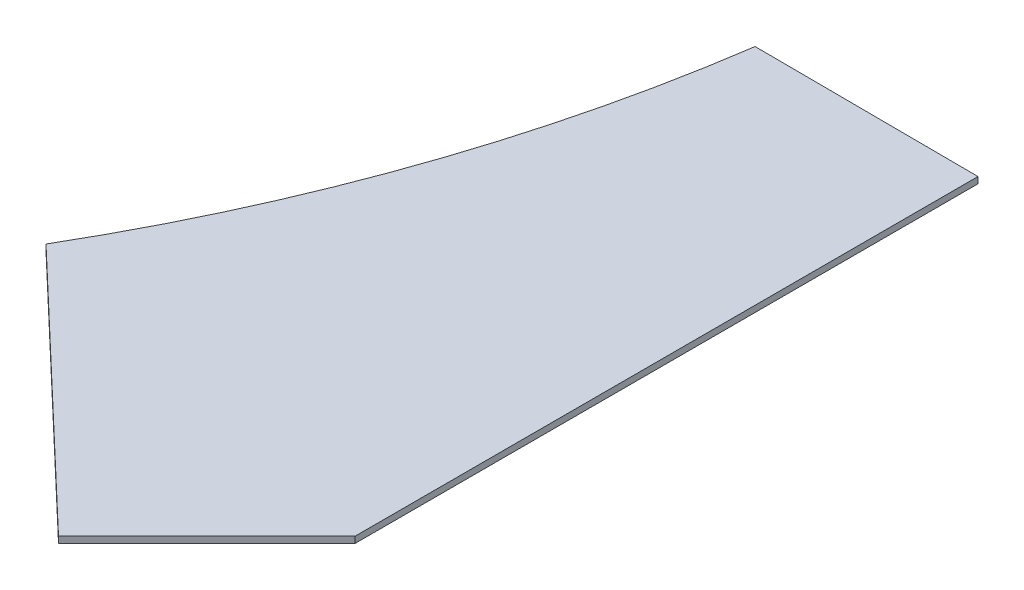
ISO-10303-21;
HEADER;
FILE_DESCRIPTION(('STEP AP214'),'2;1');
FILE_NAME('part.step','',(''),(''),'','','');
FILE_SCHEMA(('AUTOMOTIVE_DESIGN { 1 0 10303 214 1 1 1 1 }'));
ENDSEC;
DATA;
#1=APPLICATION_CONTEXT('core data for automotive mechanical design processes');
#2=APPLICATION_PROTOCOL_DEFINITION('international standard','automotive_design',2000,#1);
#3=PRODUCT_CONTEXT('',#1,'mechanical');
#4=PRODUCT('Part','Part','',(#3));
#5=PRODUCT_RELATED_PRODUCT_CATEGORY('part','',(#4));
#6=PRODUCT_DEFINITION_FORMATION('','',#4);
#7=PRODUCT_DEFINITION_CONTEXT('part definition',#1,'design');
#8=PRODUCT_DEFINITION('design','',#6,#7);
#9=PRODUCT_DEFINITION_SHAPE('','',#8);
#10=(LENGTH_UNIT() NAMED_UNIT(*) SI_UNIT(.MILLI.,.METRE.));
#11=(NAMED_UNIT(*) PLANE_ANGLE_UNIT() SI_UNIT($,.RADIAN.));
#12=(NAMED_UNIT(*) SI_UNIT($,.STERADIAN.) SOLID_ANGLE_UNIT());
#13=UNCERTAINTY_MEASURE_WITH_UNIT(LENGTH_MEASURE(1.E-05),#10,'distance_accuracy_value','');
#14=(GEOMETRIC_REPRESENTATION_CONTEXT(3) GLOBAL_UNCERTAINTY_ASSIGNED_CONTEXT((#13)) GLOBAL_UNIT_ASSIGNED_CONTEXT((#10,
#11,#12)) REPRESENTATION_CONTEXT('',''));
#15=CARTESIAN_POINT('',(0.,0.,0.));
#16=DIRECTION('',(0.,0.,1.));
#17=DIRECTION('',(1.,0.,0.));
#18=AXIS2_PLACEMENT_3D('',#15,#16,#17);
#19=CARTESIAN_POINT('',(264.,-2.,0.));
#20=DIRECTION('',(1.,0.,0.));
#21=DIRECTION('',(0.,0.,-1.));
#22=AXIS2_PLACEMENT_3D('',#19,#20,#21);
#23=PLANE('',#22);
#24=DIRECTION('',(0.,0.,1.));
#25=VECTOR('',#24,1.);
#26=CARTESIAN_POINT('',(264.,-2.,131.979594929244));
#27=LINE('',#26,#25);
#28=CARTESIAN_POINT('',(264.,-2.,33.2298257626164));
#29=VERTEX_POINT('',#28);
#30=CARTESIAN_POINT('',(264.,-2.,131.979594929244));
#31=VERTEX_POINT('',#30);
#32=EDGE_CURVE('E91',#29,#31,#27,.T.);
#33=ORIENTED_EDGE('',*,*,#32,.T.);
#34=DIRECTION('',(0.,1.,0.));
#35=VECTOR('',#34,1.);
#36=CARTESIAN_POINT('',(264.,-2.,131.979594929244));
#37=LINE('',#36,#35);
#38=CARTESIAN_POINT('',(264.,-3.,131.979594929244));
#39=VERTEX_POINT('',#38);
#40=EDGE_CURVE('E11',#39,#31,#37,.T.);
#41=ORIENTED_EDGE('',*,*,#40,.F.);
#42=DIRECTION('',(0.,0.,1.));
#43=VECTOR('',#42,1.);
#44=CARTESIAN_POINT('',(264.,-3.,131.979594929244));
#45=LINE('',#44,#43);
#46=CARTESIAN_POINT('',(264.,-3.,33.2298257626164));
#47=VERTEX_POINT('',#46);
#48=EDGE_CURVE('E89',#47,#39,#45,.T.);
#49=ORIENTED_EDGE('',*,*,#48,.F.);
#50=DIRECTION('',(0.,1.,0.));
#51=VECTOR('',#50,1.);
#52=CARTESIAN_POINT('',(264.,-3.,33.2298257626164));
#53=LINE('',#52,#51);
#54=EDGE_CURVE('E128',#47,#29,#53,.T.);
#55=ORIENTED_EDGE('',*,*,#54,.T.);
#56=EDGE_LOOP('',(#33,#41,#49,#55));
#57=FACE_BOUND('',#56,.T.);
#58=ADVANCED_FACE('F36',(#57),#23,.T.);
#59=CARTESIAN_POINT('',(0.,-2.,0.));
#60=DIRECTION('',(0.,1.,0.));
#61=DIRECTION('',(0.,0.,1.));
#62=AXIS2_PLACEMENT_3D('',#59,#60,#61);
#63=CYLINDRICAL_SURFACE('',#62,230.867927612304);
#64=CARTESIAN_POINT('',(0.,-2.,0.));
#65=DIRECTION('',(0.,1.,0.));
#66=DIRECTION('',(0.,0.,1.));
#67=AXIS2_PLACEMENT_3D('',#64,#65,#66);
#68=CIRCLE('',#67,230.867927612304);
#69=CARTESIAN_POINT('',(199.395295800083,-2.,116.368019716748));
#70=VERTEX_POINT('',#69);
#71=CARTESIAN_POINT('',(228.489590238678,-2.,33.053095960304));
#72=VERTEX_POINT('',#71);
#73=EDGE_CURVE('E74',#70,#72,#68,.T.);
#74=ORIENTED_EDGE('',*,*,#73,.T.);
#75=DIRECTION('',(0.,1.,0.));
#76=VECTOR('',#75,1.);
#77=CARTESIAN_POINT('',(228.489590238678,-3.,33.053095960304));
#78=LINE('',#77,#76);
#79=CARTESIAN_POINT('',(228.489590238678,-3.,33.053095960304));
#80=VERTEX_POINT('',#79);
#81=EDGE_CURVE('E45',#80,#72,#78,.T.);
#82=ORIENTED_EDGE('',*,*,#81,.F.);
#83=CARTESIAN_POINT('',(0.,-3.,0.));
#84=DIRECTION('',(0.,1.,0.));
#85=DIRECTION('',(0.,0.,1.));
#86=AXIS2_PLACEMENT_3D('',#83,#84,#85);
#87=CIRCLE('',#86,230.867927612304);
#88=CARTESIAN_POINT('',(199.395295800083,-3.,116.368019716748));
#89=VERTEX_POINT('',#88);
#90=EDGE_CURVE('E123',#89,#80,#87,.T.);
#91=ORIENTED_EDGE('',*,*,#90,.F.);
#92=DIRECTION('',(0.,1.,0.));
#93=VECTOR('',#92,1.);
#94=CARTESIAN_POINT('',(199.395295800083,-3.,116.368019716748));
#95=LINE('',#94,#93);
#96=EDGE_CURVE('E109',#89,#70,#95,.T.);
#97=ORIENTED_EDGE('',*,*,#96,.T.);
#98=EDGE_LOOP('',(#74,#82,#91,#97));
#99=FACE_BOUND('',#98,.T.);
#100=ADVANCED_FACE('F135',(#99),#63,.F.);
#101=CARTESIAN_POINT('',(264.,-2.,131.979594929244));
#102=DIRECTION('',(0.707107865975289,0.,0.707105696396142));
#103=DIRECTION('',(0.707105696396142,0.,-0.707107865975289));
#104=AXIS2_PLACEMENT_3D('',#101,#102,#103);
#105=PLANE('',#104);
#106=ORIENTED_EDGE('',*,*,#40,.T.);
#107=DIRECTION('',(-0.707105696396142,0.,0.707107865975289));
#108=VECTOR('',#107,1.);
#109=CARTESIAN_POINT('',(264.,-2.,131.979594929244));
#110=LINE('',#109,#108);
#111=CARTESIAN_POINT('',(240.494949992761,-2.,155.484717055922));
#112=VERTEX_POINT('',#111);
#113=EDGE_CURVE('E115',#31,#112,#110,.T.);
#114=ORIENTED_EDGE('',*,*,#113,.T.);
#115=DIRECTION('',(0.,1.,0.));
#116=VECTOR('',#115,1.);
#117=CARTESIAN_POINT('',(240.494949992761,-3.,155.484717055922));
#118=LINE('',#117,#116);
#119=CARTESIAN_POINT('',(240.494949992761,-3.,155.484717055922));
#120=VERTEX_POINT('',#119);
#121=EDGE_CURVE('E103',#120,#112,#118,.T.);
#122=ORIENTED_EDGE('',*,*,#121,.F.);
#123=DIRECTION('',(-0.707105696396142,0.,0.707107865975289));
#124=VECTOR('',#123,1.);
#125=CARTESIAN_POINT('',(240.494949992761,-3.,155.484717055922));
#126=LINE('',#125,#124);
#127=EDGE_CURVE('E97',#39,#120,#126,.T.);
#128=ORIENTED_EDGE('',*,*,#127,.F.);
#129=EDGE_LOOP('',(#106,#114,#122,#128));
#130=FACE_BOUND('',#129,.T.);
#131=ADVANCED_FACE('F101',(#130),#105,.T.);
#132=CARTESIAN_POINT('',(228.489590238678,-3.,33.053095960304));
#133=DIRECTION('',(-0.00497678328219708,0.,0.999987615737396));
#134=DIRECTION('',(0.999987615737396,0.,0.00497678328219708));
#135=AXIS2_PLACEMENT_3D('',#132,#133,#134);
#136=PLANE('',#135);
#137=DIRECTION('',(0.999987615737396,0.,0.00497678328219708));
#138=VECTOR('',#137,1.);
#139=CARTESIAN_POINT('',(228.489590238678,-2.,33.053095960304));
#140=LINE('',#139,#138);
#141=EDGE_CURVE('E68',#72,#29,#140,.T.);
#142=ORIENTED_EDGE('',*,*,#141,.T.);
#143=ORIENTED_EDGE('',*,*,#54,.F.);
#144=DIRECTION('',(0.999987615737396,0.,0.00497678328219708));
#145=VECTOR('',#144,1.);
#146=CARTESIAN_POINT('',(228.489590238678,-3.,33.053095960304));
#147=LINE('',#146,#145);
#148=EDGE_CURVE('E80',#80,#47,#147,.T.);
#149=ORIENTED_EDGE('',*,*,#148,.F.);
#150=ORIENTED_EDGE('',*,*,#81,.T.);
#151=EDGE_LOOP('',(#142,#143,#149,#150));
#152=FACE_BOUND('',#151,.T.);
#153=ADVANCED_FACE('F132',(#152),#136,.F.);
#154=CARTESIAN_POINT('',(240.494949992761,-3.,155.484717055922));
#155=DIRECTION('',(0.689416411957319,0.,-0.724365246905107));
#156=DIRECTION('',(-0.724365246905107,0.,-0.689416411957319));
#157=AXIS2_PLACEMENT_3D('',#154,#155,#156);
#158=PLANE('',#157);
#159=DIRECTION('',(-0.724365246905107,0.,-0.689416411957319));
#160=VECTOR('',#159,1.);
#161=CARTESIAN_POINT('',(240.494949992761,-2.,155.484717055922));
#162=LINE('',#161,#160);
#163=EDGE_CURVE('E120',#112,#70,#162,.T.);
#164=ORIENTED_EDGE('',*,*,#163,.T.);
#165=ORIENTED_EDGE('',*,*,#96,.F.);
#166=DIRECTION('',(-0.724365246905107,0.,-0.689416411957319));
#167=VECTOR('',#166,1.);
#168=CARTESIAN_POINT('',(240.494949992761,-3.,155.484717055922));
#169=LINE('',#168,#167);
#170=EDGE_CURVE('E53',#120,#89,#169,.T.);
#171=ORIENTED_EDGE('',*,*,#170,.F.);
#172=ORIENTED_EDGE('',*,*,#121,.T.);
#173=EDGE_LOOP('',(#164,#165,#171,#172));
#174=FACE_BOUND('',#173,.T.);
#175=ADVANCED_FACE('F143',(#174),#158,.F.);
#176=CARTESIAN_POINT('',(0.,-3.,0.));
#177=DIRECTION('',(0.,1.,0.));
#178=DIRECTION('',(0.,0.,1.));
#179=AXIS2_PLACEMENT_3D('',#176,#177,#178);
#180=PLANE('',#179);
#181=ORIENTED_EDGE('',*,*,#90,.T.);
#182=ORIENTED_EDGE('',*,*,#148,.T.);
#183=ORIENTED_EDGE('',*,*,#48,.T.);
#184=ORIENTED_EDGE('',*,*,#127,.T.);
#185=ORIENTED_EDGE('',*,*,#170,.T.);
#186=EDGE_LOOP('',(#181,#182,#183,#184,#185));
#187=FACE_BOUND('',#186,.T.);
#188=ADVANCED_FACE('F96',(#187),#180,.F.);
#189=CARTESIAN_POINT('',(0.,-2.,0.));
#190=DIRECTION('',(0.,1.,0.));
#191=DIRECTION('',(0.,0.,1.));
#192=AXIS2_PLACEMENT_3D('',#189,#190,#191);
#193=PLANE('',#192);
#194=ORIENTED_EDGE('',*,*,#113,.F.);
#195=ORIENTED_EDGE('',*,*,#32,.F.);
#196=ORIENTED_EDGE('',*,*,#141,.F.);
#197=ORIENTED_EDGE('',*,*,#73,.F.);
#198=ORIENTED_EDGE('',*,*,#163,.F.);
#199=EDGE_LOOP('',(#194,#195,#196,#197,#198));
#200=FACE_BOUND('',#199,.T.);
#201=ADVANCED_FACE('F136',(#200),#193,.T.);
#202=CLOSED_SHELL('',(#58,#100,#131,#153,#175,#188,#201));
#203=MANIFOLD_SOLID_BREP('B2',#202);
#204=ADVANCED_BREP_SHAPE_REPRESENTATION('',(#18,#203),#14);
#205=SHAPE_DEFINITION_REPRESENTATION(#9,#204);
ENDSEC;
END-ISO-10303-21;
